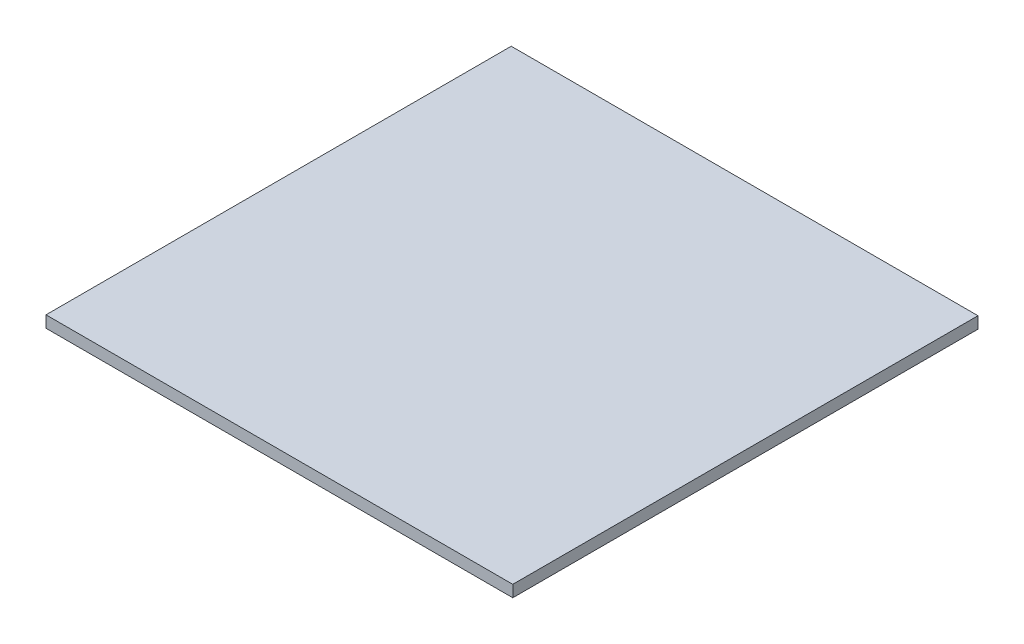
ISO-10303-21;
HEADER;
FILE_DESCRIPTION(('STEP AP214'),'2;1');
FILE_NAME('part.step','',(''),(''),'','','');
FILE_SCHEMA(('AUTOMOTIVE_DESIGN { 1 0 10303 214 1 1 1 1 }'));
ENDSEC;
DATA;
#1=APPLICATION_CONTEXT('core data for automotive mechanical design processes');
#2=APPLICATION_PROTOCOL_DEFINITION('international standard','automotive_design',2000,#1);
#3=PRODUCT_CONTEXT('',#1,'mechanical');
#4=PRODUCT('Part','Part','',(#3));
#5=PRODUCT_RELATED_PRODUCT_CATEGORY('part','',(#4));
#6=PRODUCT_DEFINITION_FORMATION('','',#4);
#7=PRODUCT_DEFINITION_CONTEXT('part definition',#1,'design');
#8=PRODUCT_DEFINITION('design','',#6,#7);
#9=PRODUCT_DEFINITION_SHAPE('','',#8);
#10=(LENGTH_UNIT() NAMED_UNIT(*) SI_UNIT(.MILLI.,.METRE.));
#11=(NAMED_UNIT(*) PLANE_ANGLE_UNIT() SI_UNIT($,.RADIAN.));
#12=(NAMED_UNIT(*) SI_UNIT($,.STERADIAN.) SOLID_ANGLE_UNIT());
#13=UNCERTAINTY_MEASURE_WITH_UNIT(LENGTH_MEASURE(1.E-05),#10,'distance_accuracy_value','');
#14=(GEOMETRIC_REPRESENTATION_CONTEXT(3) GLOBAL_UNCERTAINTY_ASSIGNED_CONTEXT((#13)) GLOBAL_UNIT_ASSIGNED_CONTEXT((#10,
#11,#12)) REPRESENTATION_CONTEXT('',''));
#15=CARTESIAN_POINT('',(0.,0.,0.));
#16=DIRECTION('',(0.,0.,1.));
#17=DIRECTION('',(1.,0.,0.));
#18=AXIS2_PLACEMENT_3D('',#15,#16,#17);
#19=CARTESIAN_POINT('',(600.,30.,598.));
#20=DIRECTION('',(-1.,0.,0.));
#21=DIRECTION('',(0.,0.,1.));
#22=AXIS2_PLACEMENT_3D('',#19,#20,#21);
#23=PLANE('',#22);
#24=DIRECTION('',(0.,0.,-1.));
#25=VECTOR('',#24,1.);
#26=CARTESIAN_POINT('',(600.,0.,598.));
#27=LINE('',#26,#25);
#28=CARTESIAN_POINT('',(600.,0.,598.));
#29=VERTEX_POINT('',#28);
#30=CARTESIAN_POINT('',(600.,0.,-598.));
#31=VERTEX_POINT('',#30);
#32=EDGE_CURVE('E96',#29,#31,#27,.T.);
#33=ORIENTED_EDGE('',*,*,#32,.T.);
#34=DIRECTION('',(0.,-1.,0.));
#35=VECTOR('',#34,1.);
#36=CARTESIAN_POINT('',(600.,30.,-598.));
#37=LINE('',#36,#35);
#38=CARTESIAN_POINT('',(600.,30.,-598.));
#39=VERTEX_POINT('',#38);
#40=EDGE_CURVE('E11',#39,#31,#37,.T.);
#41=ORIENTED_EDGE('',*,*,#40,.F.);
#42=DIRECTION('',(0.,0.,-1.));
#43=VECTOR('',#42,1.);
#44=CARTESIAN_POINT('',(600.,30.,598.));
#45=LINE('',#44,#43);
#46=CARTESIAN_POINT('',(600.,30.,598.));
#47=VERTEX_POINT('',#46);
#48=EDGE_CURVE('E84',#47,#39,#45,.T.);
#49=ORIENTED_EDGE('',*,*,#48,.F.);
#50=DIRECTION('',(0.,-1.,0.));
#51=VECTOR('',#50,1.);
#52=CARTESIAN_POINT('',(600.,30.,598.));
#53=LINE('',#52,#51);
#54=EDGE_CURVE('E92',#47,#29,#53,.T.);
#55=ORIENTED_EDGE('',*,*,#54,.T.);
#56=EDGE_LOOP('',(#33,#41,#49,#55));
#57=FACE_BOUND('',#56,.T.);
#58=ADVANCED_FACE('F33',(#57),#23,.F.);
#59=CARTESIAN_POINT('',(-600.,30.,-598.));
#60=DIRECTION('',(0.,0.,1.));
#61=DIRECTION('',(1.,0.,0.));
#62=AXIS2_PLACEMENT_3D('',#59,#60,#61);
#63=PLANE('',#62);
#64=DIRECTION('',(-1.,0.,0.));
#65=VECTOR('',#64,1.);
#66=CARTESIAN_POINT('',(-600.,0.,-598.));
#67=LINE('',#66,#65);
#68=CARTESIAN_POINT('',(-600.,0.,-598.));
#69=VERTEX_POINT('',#68);
#70=EDGE_CURVE('E88',#31,#69,#67,.T.);
#71=ORIENTED_EDGE('',*,*,#70,.T.);
#72=DIRECTION('',(0.,-1.,0.));
#73=VECTOR('',#72,1.);
#74=CARTESIAN_POINT('',(-600.,30.,-598.));
#75=LINE('',#74,#73);
#76=CARTESIAN_POINT('',(-600.,30.,-598.));
#77=VERTEX_POINT('',#76);
#78=EDGE_CURVE('E41',#77,#69,#75,.T.);
#79=ORIENTED_EDGE('',*,*,#78,.F.);
#80=DIRECTION('',(-1.,0.,0.));
#81=VECTOR('',#80,1.);
#82=CARTESIAN_POINT('',(-600.,30.,-598.));
#83=LINE('',#82,#81);
#84=EDGE_CURVE('E79',#39,#77,#83,.T.);
#85=ORIENTED_EDGE('',*,*,#84,.F.);
#86=ORIENTED_EDGE('',*,*,#40,.T.);
#87=EDGE_LOOP('',(#71,#79,#85,#86));
#88=FACE_BOUND('',#87,.T.);
#89=ADVANCED_FACE('F87',(#88),#63,.F.);
#90=CARTESIAN_POINT('',(-600.,30.,598.));
#91=DIRECTION('',(1.,0.,0.));
#92=DIRECTION('',(0.,0.,-1.));
#93=AXIS2_PLACEMENT_3D('',#90,#91,#92);
#94=PLANE('',#93);
#95=DIRECTION('',(0.,0.,1.));
#96=VECTOR('',#95,1.);
#97=CARTESIAN_POINT('',(-600.,0.,598.));
#98=LINE('',#97,#96);
#99=CARTESIAN_POINT('',(-600.,0.,598.));
#100=VERTEX_POINT('',#99);
#101=EDGE_CURVE('E66',#69,#100,#98,.T.);
#102=ORIENTED_EDGE('',*,*,#101,.T.);
#103=DIRECTION('',(0.,-1.,0.));
#104=VECTOR('',#103,1.);
#105=CARTESIAN_POINT('',(-600.,30.,598.));
#106=LINE('',#105,#104);
#107=CARTESIAN_POINT('',(-600.,30.,598.));
#108=VERTEX_POINT('',#107);
#109=EDGE_CURVE('E89',#108,#100,#106,.T.);
#110=ORIENTED_EDGE('',*,*,#109,.F.);
#111=DIRECTION('',(0.,0.,1.));
#112=VECTOR('',#111,1.);
#113=CARTESIAN_POINT('',(-600.,30.,598.));
#114=LINE('',#113,#112);
#115=EDGE_CURVE('E82',#77,#108,#114,.T.);
#116=ORIENTED_EDGE('',*,*,#115,.F.);
#117=ORIENTED_EDGE('',*,*,#78,.T.);
#118=EDGE_LOOP('',(#102,#110,#116,#117));
#119=FACE_BOUND('',#118,.T.);
#120=ADVANCED_FACE('F90',(#119),#94,.F.);
#121=CARTESIAN_POINT('',(-600.,30.,598.));
#122=DIRECTION('',(0.,0.,-1.));
#123=DIRECTION('',(-1.,0.,0.));
#124=AXIS2_PLACEMENT_3D('',#121,#122,#123);
#125=PLANE('',#124);
#126=DIRECTION('',(1.,0.,0.));
#127=VECTOR('',#126,1.);
#128=CARTESIAN_POINT('',(-600.,0.,598.));
#129=LINE('',#128,#127);
#130=EDGE_CURVE('E72',#100,#29,#129,.T.);
#131=ORIENTED_EDGE('',*,*,#130,.T.);
#132=ORIENTED_EDGE('',*,*,#54,.F.);
#133=DIRECTION('',(1.,0.,0.));
#134=VECTOR('',#133,1.);
#135=CARTESIAN_POINT('',(-600.,30.,598.));
#136=LINE('',#135,#134);
#137=EDGE_CURVE('E49',#108,#47,#136,.T.);
#138=ORIENTED_EDGE('',*,*,#137,.F.);
#139=ORIENTED_EDGE('',*,*,#109,.T.);
#140=EDGE_LOOP('',(#131,#132,#138,#139));
#141=FACE_BOUND('',#140,.T.);
#142=ADVANCED_FACE('F103',(#141),#125,.F.);
#143=CARTESIAN_POINT('',(0.,30.,0.));
#144=DIRECTION('',(0.,-1.,0.));
#145=DIRECTION('',(0.,0.,-1.));
#146=AXIS2_PLACEMENT_3D('',#143,#144,#145);
#147=PLANE('',#146);
#148=ORIENTED_EDGE('',*,*,#48,.T.);
#149=ORIENTED_EDGE('',*,*,#84,.T.);
#150=ORIENTED_EDGE('',*,*,#115,.T.);
#151=ORIENTED_EDGE('',*,*,#137,.T.);
#152=EDGE_LOOP('',(#148,#149,#150,#151));
#153=FACE_BOUND('',#152,.T.);
#154=ADVANCED_FACE('F80',(#153),#147,.F.);
#155=CARTESIAN_POINT('',(0.,0.,0.));
#156=DIRECTION('',(0.,-1.,0.));
#157=DIRECTION('',(0.,0.,-1.));
#158=AXIS2_PLACEMENT_3D('',#155,#156,#157);
#159=PLANE('',#158);
#160=ORIENTED_EDGE('',*,*,#32,.F.);
#161=ORIENTED_EDGE('',*,*,#130,.F.);
#162=ORIENTED_EDGE('',*,*,#101,.F.);
#163=ORIENTED_EDGE('',*,*,#70,.F.);
#164=EDGE_LOOP('',(#160,#161,#162,#163));
#165=FACE_BOUND('',#164,.T.);
#166=ADVANCED_FACE('F106',(#165),#159,.T.);
#167=CLOSED_SHELL('',(#58,#89,#120,#142,#154,#166));
#168=MANIFOLD_SOLID_BREP('B2',#167);
#169=ADVANCED_BREP_SHAPE_REPRESENTATION('',(#18,#168),#14);
#170=SHAPE_DEFINITION_REPRESENTATION(#9,#169);
ENDSEC;
END-ISO-10303-21;
